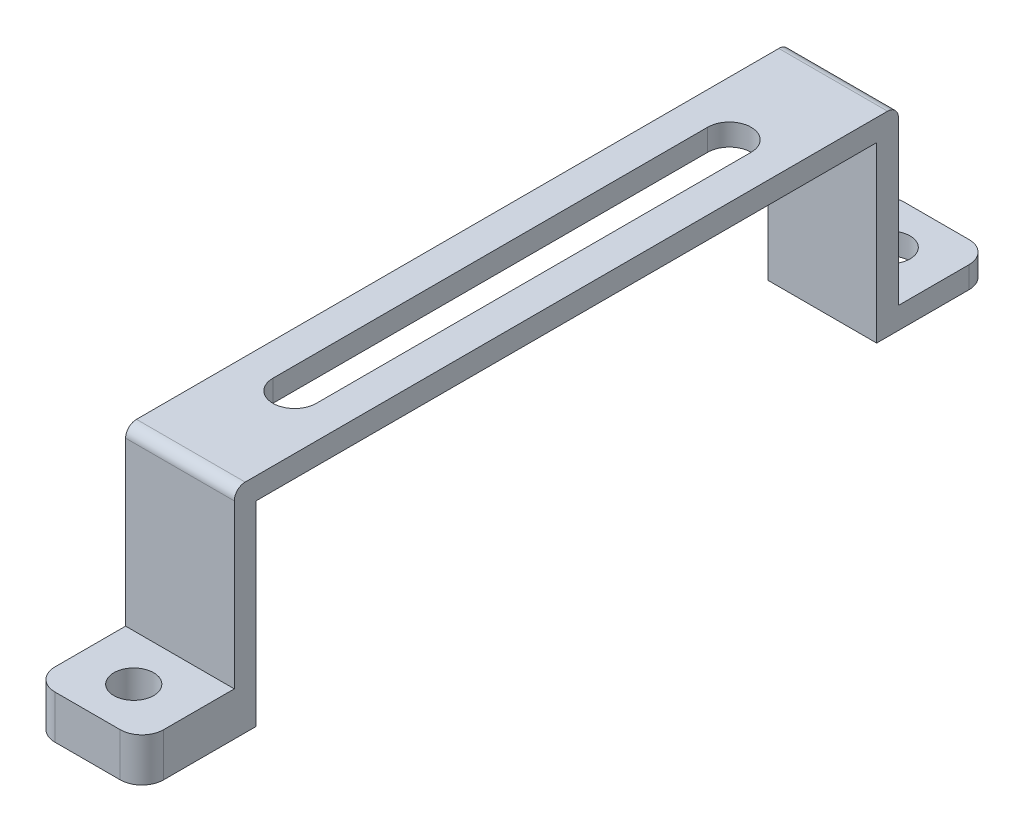
ISO-10303-21;
HEADER;
FILE_DESCRIPTION(('STEP AP214'),'2;1');
FILE_NAME('part.step','',(''),(''),'','','');
FILE_SCHEMA(('AUTOMOTIVE_DESIGN { 1 0 10303 214 1 1 1 1 }'));
ENDSEC;
DATA;
#1=APPLICATION_CONTEXT('core data for automotive mechanical design processes');
#2=APPLICATION_PROTOCOL_DEFINITION('international standard','automotive_design',2000,#1);
#3=PRODUCT_CONTEXT('',#1,'mechanical');
#4=PRODUCT('Part','Part','',(#3));
#5=PRODUCT_RELATED_PRODUCT_CATEGORY('part','',(#4));
#6=PRODUCT_DEFINITION_FORMATION('','',#4);
#7=PRODUCT_DEFINITION_CONTEXT('part definition',#1,'design');
#8=PRODUCT_DEFINITION('design','',#6,#7);
#9=PRODUCT_DEFINITION_SHAPE('','',#8);
#10=(LENGTH_UNIT() NAMED_UNIT(*) SI_UNIT(.MILLI.,.METRE.));
#11=(NAMED_UNIT(*) PLANE_ANGLE_UNIT() SI_UNIT($,.RADIAN.));
#12=(NAMED_UNIT(*) SI_UNIT($,.STERADIAN.) SOLID_ANGLE_UNIT());
#13=UNCERTAINTY_MEASURE_WITH_UNIT(LENGTH_MEASURE(1.E-05),#10,'distance_accuracy_value','');
#14=(GEOMETRIC_REPRESENTATION_CONTEXT(3) GLOBAL_UNCERTAINTY_ASSIGNED_CONTEXT((#13)) GLOBAL_UNIT_ASSIGNED_CONTEXT((#10,
#11,#12)) REPRESENTATION_CONTEXT('',''));
#15=CARTESIAN_POINT('',(0.,0.,0.));
#16=DIRECTION('',(0.,0.,1.));
#17=DIRECTION('',(1.,0.,0.));
#18=AXIS2_PLACEMENT_3D('',#15,#16,#17);
#19=CARTESIAN_POINT('',(0.,0.,0.));
#20=DIRECTION('',(0.,1.,0.));
#21=DIRECTION('',(0.,0.,1.));
#22=AXIS2_PLACEMENT_3D('',#19,#20,#21);
#23=PLANE('',#22);
#24=CARTESIAN_POINT('',(11.7063002694729,0.,8.49782961465778));
#25=DIRECTION('',(0.,1.,0.));
#26=DIRECTION('',(0.,0.,1.));
#27=AXIS2_PLACEMENT_3D('',#24,#25,#26);
#28=CIRCLE('',#27,1.99999999999999);
#29=CARTESIAN_POINT('',(13.7063002694728,0.,8.49782961465778));
#30=VERTEX_POINT('',#29);
#31=CARTESIAN_POINT('',(9.70630026947286,0.,8.49782961465778));
#32=VERTEX_POINT('',#31);
#33=EDGE_CURVE('E313',#30,#32,#28,.T.);
#34=ORIENTED_EDGE('',*,*,#33,.T.);
#35=DIRECTION('',(0.,0.,1.));
#36=VECTOR('',#35,1.);
#37=CARTESIAN_POINT('',(9.70630026947286,0.,8.49782961465778));
#38=LINE('',#37,#36);
#39=CARTESIAN_POINT('',(9.70630026947286,0.,48.4978296146578));
#40=VERTEX_POINT('',#39);
#41=EDGE_CURVE('E332',#32,#40,#38,.T.);
#42=ORIENTED_EDGE('',*,*,#41,.T.);
#43=CARTESIAN_POINT('',(11.7063002694729,0.,48.4978296146578));
#44=DIRECTION('',(0.,1.,0.));
#45=DIRECTION('',(0.,0.,1.));
#46=AXIS2_PLACEMENT_3D('',#43,#44,#45);
#47=CIRCLE('',#46,1.99999999999999);
#48=CARTESIAN_POINT('',(13.7063002694728,0.,48.4978296146578));
#49=VERTEX_POINT('',#48);
#50=EDGE_CURVE('E336',#40,#49,#47,.T.);
#51=ORIENTED_EDGE('',*,*,#50,.T.);
#52=DIRECTION('',(0.,0.,-1.));
#53=VECTOR('',#52,1.);
#54=CARTESIAN_POINT('',(13.7063002694728,0.,8.49782961465778));
#55=LINE('',#54,#53);
#56=EDGE_CURVE('E318',#49,#30,#55,.T.);
#57=ORIENTED_EDGE('',*,*,#56,.T.);
#58=EDGE_LOOP('',(#34,#42,#51,#57));
#59=FACE_BOUND('',#58,.T.);
#60=DIRECTION('',(-1.,0.,0.));
#61=VECTOR('',#60,1.);
#62=CARTESIAN_POINT('',(6.70630026947285,0.,-0.0521703853422189));
#63=LINE('',#62,#61);
#64=CARTESIAN_POINT('',(16.7063002694728,0.,-0.0521703853422206));
#65=VERTEX_POINT('',#64);
#66=CARTESIAN_POINT('',(6.70630026947285,0.,-0.0521703853422189));
#67=VERTEX_POINT('',#66);
#68=EDGE_CURVE('E254',#65,#67,#63,.T.);
#69=ORIENTED_EDGE('',*,*,#68,.F.);
#70=DIRECTION('',(0.,0.,-1.));
#71=VECTOR('',#70,1.);
#72=CARTESIAN_POINT('',(16.7063002694728,0.,-0.00217038534222006));
#73=LINE('',#72,#71);
#74=CARTESIAN_POINT('',(16.7063002694728,0.,57.0478296146578));
#75=VERTEX_POINT('',#74);
#76=EDGE_CURVE('E362',#75,#65,#73,.T.);
#77=ORIENTED_EDGE('',*,*,#76,.F.);
#78=DIRECTION('',(1.,0.,0.));
#79=VECTOR('',#78,1.);
#80=CARTESIAN_POINT('',(6.70630026947285,0.,57.0478296146578));
#81=LINE('',#80,#79);
#82=CARTESIAN_POINT('',(6.70630026947285,0.,57.0478296146578));
#83=VERTEX_POINT('',#82);
#84=EDGE_CURVE('E197',#83,#75,#81,.T.);
#85=ORIENTED_EDGE('',*,*,#84,.F.);
#86=DIRECTION('',(0.,0.,1.));
#87=VECTOR('',#86,1.);
#88=CARTESIAN_POINT('',(6.70630026947285,0.,-0.00217038534221919));
#89=LINE('',#88,#87);
#90=EDGE_CURVE('E356',#67,#83,#89,.T.);
#91=ORIENTED_EDGE('',*,*,#90,.F.);
#92=EDGE_LOOP('',(#69,#77,#85,#91));
#93=FACE_BOUND('',#92,.T.);
#94=ADVANCED_FACE('F39',(#59,#93),#23,.F.);
#95=CARTESIAN_POINT('',(0.,2.,0.));
#96=DIRECTION('',(0.,1.,0.));
#97=DIRECTION('',(0.,0.,1.));
#98=AXIS2_PLACEMENT_3D('',#95,#96,#97);
#99=PLANE('',#98);
#100=DIRECTION('',(0.,0.,1.));
#101=VECTOR('',#100,1.);
#102=CARTESIAN_POINT('',(6.70630026947285,2.,-0.00217038534221919));
#103=LINE('',#102,#101);
#104=CARTESIAN_POINT('',(6.70630026947285,2.,-1.05217038534222));
#105=VERTEX_POINT('',#104);
#106=CARTESIAN_POINT('',(6.70630026947285,2.,58.0478296146578));
#107=VERTEX_POINT('',#106);
#108=EDGE_CURVE('E357',#105,#107,#103,.T.);
#109=ORIENTED_EDGE('',*,*,#108,.T.);
#110=DIRECTION('',(-1.,0.,0.));
#111=VECTOR('',#110,1.);
#112=CARTESIAN_POINT('',(0.,2.,58.0478296146578));
#113=LINE('',#112,#111);
#114=CARTESIAN_POINT('',(16.7063002694728,2.,58.0478296146578));
#115=VERTEX_POINT('',#114);
#116=EDGE_CURVE('E383',#107,#115,#113,.F.);
#117=ORIENTED_EDGE('',*,*,#116,.T.);
#118=DIRECTION('',(0.,0.,-1.));
#119=VECTOR('',#118,1.);
#120=CARTESIAN_POINT('',(16.7063002694728,2.,-0.00217038534222006));
#121=LINE('',#120,#119);
#122=CARTESIAN_POINT('',(16.7063002694728,2.,-1.05217038534222));
#123=VERTEX_POINT('',#122);
#124=EDGE_CURVE('E361',#115,#123,#121,.T.);
#125=ORIENTED_EDGE('',*,*,#124,.T.);
#126=DIRECTION('',(1.,0.,0.));
#127=VECTOR('',#126,1.);
#128=CARTESIAN_POINT('',(0.,2.,-1.05217038534222));
#129=LINE('',#128,#127);
#130=EDGE_CURVE('E380',#123,#105,#129,.F.);
#131=ORIENTED_EDGE('',*,*,#130,.T.);
#132=EDGE_LOOP('',(#109,#117,#125,#131));
#133=FACE_BOUND('',#132,.T.);
#134=DIRECTION('',(0.,0.,1.));
#135=VECTOR('',#134,1.);
#136=CARTESIAN_POINT('',(9.70630026947286,2.,8.49782961465778));
#137=LINE('',#136,#135);
#138=CARTESIAN_POINT('',(9.70630026947286,2.,8.49782961465778));
#139=VERTEX_POINT('',#138);
#140=CARTESIAN_POINT('',(9.70630026947286,2.,48.4978296146578));
#141=VERTEX_POINT('',#140);
#142=EDGE_CURVE('E317',#139,#141,#137,.T.);
#143=ORIENTED_EDGE('',*,*,#142,.F.);
#144=CARTESIAN_POINT('',(11.7063002694729,2.,8.49782961465778));
#145=DIRECTION('',(0.,1.,0.));
#146=DIRECTION('',(0.,0.,1.));
#147=AXIS2_PLACEMENT_3D('',#144,#145,#146);
#148=CIRCLE('',#147,1.99999999999999);
#149=CARTESIAN_POINT('',(13.7063002694728,2.,8.49782961465778));
#150=VERTEX_POINT('',#149);
#151=EDGE_CURVE('E314',#150,#139,#148,.T.);
#152=ORIENTED_EDGE('',*,*,#151,.F.);
#153=DIRECTION('',(0.,0.,-1.));
#154=VECTOR('',#153,1.);
#155=CARTESIAN_POINT('',(13.7063002694728,2.,8.49782961465778));
#156=LINE('',#155,#154);
#157=CARTESIAN_POINT('',(13.7063002694728,2.,48.4978296146578));
#158=VERTEX_POINT('',#157);
#159=EDGE_CURVE('E325',#158,#150,#156,.T.);
#160=ORIENTED_EDGE('',*,*,#159,.F.);
#161=CARTESIAN_POINT('',(11.7063002694729,2.,48.4978296146578));
#162=DIRECTION('',(0.,1.,0.));
#163=DIRECTION('',(0.,0.,1.));
#164=AXIS2_PLACEMENT_3D('',#161,#162,#163);
#165=CIRCLE('',#164,1.99999999999999);
#166=EDGE_CURVE('E321',#141,#158,#165,.T.);
#167=ORIENTED_EDGE('',*,*,#166,.F.);
#168=EDGE_LOOP('',(#143,#152,#160,#167));
#169=FACE_BOUND('',#168,.T.);
#170=ADVANCED_FACE('F495',(#133,#169),#99,.T.);
#171=CARTESIAN_POINT('',(6.70630026947285,2.,-0.00217038534221919));
#172=DIRECTION('',(1.,0.,0.));
#173=DIRECTION('',(0.,0.,-1.));
#174=AXIS2_PLACEMENT_3D('',#171,#172,#173);
#175=PLANE('',#174);
#176=DIRECTION('',(0.,1.,0.));
#177=VECTOR('',#176,1.);
#178=CARTESIAN_POINT('',(6.70630026947285,-15.9766,57.0478296146578));
#179=LINE('',#178,#177);
#180=CARTESIAN_POINT('',(6.70630026947285,-17.9766,57.0478296146578));
#181=VERTEX_POINT('',#180);
#182=EDGE_CURVE('E201',#181,#83,#179,.T.);
#183=ORIENTED_EDGE('',*,*,#182,.F.);
#184=DIRECTION('',(0.,0.,-1.));
#185=VECTOR('',#184,1.);
#186=CARTESIAN_POINT('',(6.70630026947285,-17.9766,67.5478296146578));
#187=LINE('',#186,#185);
#188=CARTESIAN_POINT('',(6.70630026947285,-17.9766,65.5478296146578));
#189=VERTEX_POINT('',#188);
#190=EDGE_CURVE('E212',#189,#181,#187,.T.);
#191=ORIENTED_EDGE('',*,*,#190,.F.);
#192=DIRECTION('',(0.,-1.,0.));
#193=VECTOR('',#192,1.);
#194=CARTESIAN_POINT('',(6.70630026947285,-13.9766,65.5478296146578));
#195=LINE('',#194,#193);
#196=CARTESIAN_POINT('',(6.70630026947285,-13.9766,65.5478296146578));
#197=VERTEX_POINT('',#196);
#198=EDGE_CURVE('E424',#189,#197,#195,.F.);
#199=ORIENTED_EDGE('',*,*,#198,.T.);
#200=DIRECTION('',(0.,0.,-1.));
#201=VECTOR('',#200,1.);
#202=CARTESIAN_POINT('',(6.70630026947285,-13.9766,67.5478296146578));
#203=LINE('',#202,#201);
#204=CARTESIAN_POINT('',(6.70630026947285,-13.9766,59.0478296146578));
#205=VERTEX_POINT('',#204);
#206=EDGE_CURVE('E295',#197,#205,#203,.T.);
#207=ORIENTED_EDGE('',*,*,#206,.T.);
#208=DIRECTION('',(0.,-1.,0.));
#209=VECTOR('',#208,1.);
#210=CARTESIAN_POINT('',(6.70630026947285,2.,59.0478296146578));
#211=LINE('',#210,#209);
#212=CARTESIAN_POINT('',(6.70630026947285,1.,59.0478296146578));
#213=VERTEX_POINT('',#212);
#214=EDGE_CURVE('E305',#213,#205,#211,.T.);
#215=ORIENTED_EDGE('',*,*,#214,.F.);
#216=CARTESIAN_POINT('',(6.70630026947285,1.,58.0478296146578));
#217=DIRECTION('',(1.,0.,0.));
#218=DIRECTION('',(0.,0.,-1.));
#219=AXIS2_PLACEMENT_3D('',#216,#217,#218);
#220=CIRCLE('',#219,1.);
#221=EDGE_CURVE('E377',#213,#107,#220,.F.);
#222=ORIENTED_EDGE('',*,*,#221,.T.);
#223=ORIENTED_EDGE('',*,*,#108,.F.);
#224=CARTESIAN_POINT('',(6.70630026947285,1.,-1.05217038534222));
#225=DIRECTION('',(1.,0.,0.));
#226=DIRECTION('',(0.,0.,-1.));
#227=AXIS2_PLACEMENT_3D('',#224,#225,#226);
#228=CIRCLE('',#227,1.);
#229=CARTESIAN_POINT('',(6.70630026947285,1.,-2.05217038534222));
#230=VERTEX_POINT('',#229);
#231=EDGE_CURVE('E374',#105,#230,#228,.F.);
#232=ORIENTED_EDGE('',*,*,#231,.T.);
#233=DIRECTION('',(0.,1.,0.));
#234=VECTOR('',#233,1.);
#235=CARTESIAN_POINT('',(6.70630026947285,2.,-2.05217038534222));
#236=LINE('',#235,#234);
#237=CARTESIAN_POINT('',(6.70630026947285,-13.9766,-2.05217038534222));
#238=VERTEX_POINT('',#237);
#239=EDGE_CURVE('E278',#238,#230,#236,.T.);
#240=ORIENTED_EDGE('',*,*,#239,.F.);
#241=DIRECTION('',(0.,0.,1.));
#242=VECTOR('',#241,1.);
#243=CARTESIAN_POINT('',(6.70630026947285,-13.9766,-10.5521703853422));
#244=LINE('',#243,#242);
#245=CARTESIAN_POINT('',(6.70630026947285,-13.9766,-8.55217038534222));
#246=VERTEX_POINT('',#245);
#247=EDGE_CURVE('E251',#246,#238,#244,.T.);
#248=ORIENTED_EDGE('',*,*,#247,.F.);
#249=DIRECTION('',(0.,1.,0.));
#250=VECTOR('',#249,1.);
#251=CARTESIAN_POINT('',(6.70630026947285,2.,-8.55217038534222));
#252=LINE('',#251,#250);
#253=CARTESIAN_POINT('',(6.70630026947285,-15.9766,-8.55217038534222));
#254=VERTEX_POINT('',#253);
#255=EDGE_CURVE('E421',#246,#254,#252,.F.);
#256=ORIENTED_EDGE('',*,*,#255,.T.);
#257=DIRECTION('',(0.,0.,-1.));
#258=VECTOR('',#257,1.);
#259=CARTESIAN_POINT('',(6.70630026947285,-15.9766,-2.05217038534222));
#260=LINE('',#259,#258);
#261=CARTESIAN_POINT('',(6.70630026947285,-15.9766,-0.0521703853422189));
#262=VERTEX_POINT('',#261);
#263=EDGE_CURVE('E255',#262,#254,#260,.T.);
#264=ORIENTED_EDGE('',*,*,#263,.F.);
#265=DIRECTION('',(0.,1.,0.));
#266=VECTOR('',#265,1.);
#267=CARTESIAN_POINT('',(6.70630026947285,-15.9766,-0.0521703853422189));
#268=LINE('',#267,#266);
#269=EDGE_CURVE('E265',#262,#67,#268,.T.);
#270=ORIENTED_EDGE('',*,*,#269,.T.);
#271=ORIENTED_EDGE('',*,*,#90,.T.);
#272=EDGE_LOOP('',(#183,#191,#199,#207,#215,#222,#223,#232,#240,#248,#256,#264,#270,#271));
#273=FACE_BOUND('',#272,.T.);
#274=ADVANCED_FACE('F445',(#273),#175,.F.);
#275=CARTESIAN_POINT('',(16.7063002694728,2.,-0.00217038534222006));
#276=DIRECTION('',(-1.,0.,0.));
#277=DIRECTION('',(0.,0.,1.));
#278=AXIS2_PLACEMENT_3D('',#275,#276,#277);
#279=PLANE('',#278);
#280=DIRECTION('',(0.,0.,-1.));
#281=VECTOR('',#280,1.);
#282=CARTESIAN_POINT('',(16.7063002694728,-13.9766,67.5478296146578));
#283=LINE('',#282,#281);
#284=CARTESIAN_POINT('',(16.7063002694728,-13.9766,65.5478296146578));
#285=VERTEX_POINT('',#284);
#286=CARTESIAN_POINT('',(16.7063002694728,-13.9766,59.0478296146578));
#287=VERTEX_POINT('',#286);
#288=EDGE_CURVE('E298',#285,#287,#283,.T.);
#289=ORIENTED_EDGE('',*,*,#288,.F.);
#290=DIRECTION('',(0.,1.,0.));
#291=VECTOR('',#290,1.);
#292=CARTESIAN_POINT('',(16.7063002694728,-17.9766,65.5478296146578));
#293=LINE('',#292,#291);
#294=CARTESIAN_POINT('',(16.7063002694728,-17.9766,65.5478296146578));
#295=VERTEX_POINT('',#294);
#296=EDGE_CURVE('E208',#285,#295,#293,.F.);
#297=ORIENTED_EDGE('',*,*,#296,.T.);
#298=DIRECTION('',(0.,0.,-1.));
#299=VECTOR('',#298,1.);
#300=CARTESIAN_POINT('',(16.7063002694728,-17.9766,67.5478296146578));
#301=LINE('',#300,#299);
#302=CARTESIAN_POINT('',(16.7063002694728,-17.9766,57.0478296146578));
#303=VERTEX_POINT('',#302);
#304=EDGE_CURVE('E204',#295,#303,#301,.T.);
#305=ORIENTED_EDGE('',*,*,#304,.T.);
#306=DIRECTION('',(0.,1.,0.));
#307=VECTOR('',#306,1.);
#308=CARTESIAN_POINT('',(16.7063002694728,-15.9766,57.0478296146578));
#309=LINE('',#308,#307);
#310=EDGE_CURVE('E190',#303,#75,#309,.T.);
#311=ORIENTED_EDGE('',*,*,#310,.T.);
#312=ORIENTED_EDGE('',*,*,#76,.T.);
#313=DIRECTION('',(0.,1.,0.));
#314=VECTOR('',#313,1.);
#315=CARTESIAN_POINT('',(16.7063002694728,-15.9766,-0.0521703853422206));
#316=LINE('',#315,#314);
#317=CARTESIAN_POINT('',(16.7063002694728,-15.9766,-0.0521703853422206));
#318=VERTEX_POINT('',#317);
#319=EDGE_CURVE('E271',#318,#65,#316,.T.);
#320=ORIENTED_EDGE('',*,*,#319,.F.);
#321=DIRECTION('',(0.,0.,1.));
#322=VECTOR('',#321,1.);
#323=CARTESIAN_POINT('',(16.7063002694728,-15.9766,-2.05217038534222));
#324=LINE('',#323,#322);
#325=CARTESIAN_POINT('',(16.7063002694728,-15.9766,-8.55217038534222));
#326=VERTEX_POINT('',#325);
#327=EDGE_CURVE('E259',#326,#318,#324,.T.);
#328=ORIENTED_EDGE('',*,*,#327,.F.);
#329=DIRECTION('',(0.,-1.,0.));
#330=VECTOR('',#329,1.);
#331=CARTESIAN_POINT('',(16.7063002694728,2.,-8.55217038534222));
#332=LINE('',#331,#330);
#333=CARTESIAN_POINT('',(16.7063002694728,-13.9766,-8.55217038534222));
#334=VERTEX_POINT('',#333);
#335=EDGE_CURVE('E410',#326,#334,#332,.F.);
#336=ORIENTED_EDGE('',*,*,#335,.T.);
#337=DIRECTION('',(0.,0.,1.));
#338=VECTOR('',#337,1.);
#339=CARTESIAN_POINT('',(16.7063002694728,-13.9766,-10.5521703853422));
#340=LINE('',#339,#338);
#341=CARTESIAN_POINT('',(16.7063002694728,-13.9766,-2.05217038534222));
#342=VERTEX_POINT('',#341);
#343=EDGE_CURVE('E245',#334,#342,#340,.T.);
#344=ORIENTED_EDGE('',*,*,#343,.T.);
#345=DIRECTION('',(0.,-1.,0.));
#346=VECTOR('',#345,1.);
#347=CARTESIAN_POINT('',(16.7063002694728,2.,-2.05217038534222));
#348=LINE('',#347,#346);
#349=CARTESIAN_POINT('',(16.7063002694728,1.,-2.05217038534222));
#350=VERTEX_POINT('',#349);
#351=EDGE_CURVE('E274',#350,#342,#348,.T.);
#352=ORIENTED_EDGE('',*,*,#351,.F.);
#353=CARTESIAN_POINT('',(16.7063002694728,1.,-1.05217038534222));
#354=DIRECTION('',(-1.,0.,0.));
#355=DIRECTION('',(0.,0.,1.));
#356=AXIS2_PLACEMENT_3D('',#353,#354,#355);
#357=CIRCLE('',#356,1.);
#358=EDGE_CURVE('E386',#350,#123,#357,.F.);
#359=ORIENTED_EDGE('',*,*,#358,.T.);
#360=ORIENTED_EDGE('',*,*,#124,.F.);
#361=CARTESIAN_POINT('',(16.7063002694728,1.,58.0478296146578));
#362=DIRECTION('',(-1.,0.,0.));
#363=DIRECTION('',(0.,0.,1.));
#364=AXIS2_PLACEMENT_3D('',#361,#362,#363);
#365=CIRCLE('',#364,1.);
#366=CARTESIAN_POINT('',(16.7063002694728,1.,59.0478296146578));
#367=VERTEX_POINT('',#366);
#368=EDGE_CURVE('E389',#115,#367,#365,.F.);
#369=ORIENTED_EDGE('',*,*,#368,.T.);
#370=DIRECTION('',(0.,1.,0.));
#371=VECTOR('',#370,1.);
#372=CARTESIAN_POINT('',(16.7063002694728,2.,59.0478296146578));
#373=LINE('',#372,#371);
#374=EDGE_CURVE('E309',#287,#367,#373,.T.);
#375=ORIENTED_EDGE('',*,*,#374,.F.);
#376=EDGE_LOOP('',(#289,#297,#305,#311,#312,#320,#328,#336,#344,#352,#359,#360,#369,#375));
#377=FACE_BOUND('',#376,.T.);
#378=ADVANCED_FACE('F206',(#377),#279,.F.);
#379=CARTESIAN_POINT('',(11.7063002694729,2.,8.49782961465778));
#380=DIRECTION('',(0.,-1.,0.));
#381=DIRECTION('',(0.,0.,-1.));
#382=AXIS2_PLACEMENT_3D('',#379,#380,#381);
#383=CYLINDRICAL_SURFACE('',#382,1.99999999999999);
#384=ORIENTED_EDGE('',*,*,#33,.F.);
#385=DIRECTION('',(0.,-1.,0.));
#386=VECTOR('',#385,1.);
#387=CARTESIAN_POINT('',(13.7063002694728,2.,8.49782961465778));
#388=LINE('',#387,#386);
#389=EDGE_CURVE('E328',#150,#30,#388,.T.);
#390=ORIENTED_EDGE('',*,*,#389,.F.);
#391=ORIENTED_EDGE('',*,*,#151,.T.);
#392=DIRECTION('',(0.,-1.,0.));
#393=VECTOR('',#392,1.);
#394=CARTESIAN_POINT('',(9.70630026947286,2.,8.49782961465778));
#395=LINE('',#394,#393);
#396=EDGE_CURVE('E352',#139,#32,#395,.T.);
#397=ORIENTED_EDGE('',*,*,#396,.T.);
#398=EDGE_LOOP('',(#384,#390,#391,#397));
#399=FACE_BOUND('',#398,.T.);
#400=ADVANCED_FACE('F523',(#399),#383,.F.);
#401=CARTESIAN_POINT('',(9.70630026947286,2.,8.49782961465778));
#402=DIRECTION('',(1.,0.,0.));
#403=DIRECTION('',(0.,0.,-1.));
#404=AXIS2_PLACEMENT_3D('',#401,#402,#403);
#405=PLANE('',#404);
#406=ORIENTED_EDGE('',*,*,#41,.F.);
#407=ORIENTED_EDGE('',*,*,#396,.F.);
#408=ORIENTED_EDGE('',*,*,#142,.T.);
#409=DIRECTION('',(0.,-1.,0.));
#410=VECTOR('',#409,1.);
#411=CARTESIAN_POINT('',(9.70630026947286,2.,48.4978296146578));
#412=LINE('',#411,#410);
#413=EDGE_CURVE('E349',#141,#40,#412,.T.);
#414=ORIENTED_EDGE('',*,*,#413,.T.);
#415=EDGE_LOOP('',(#406,#407,#408,#414));
#416=FACE_BOUND('',#415,.T.);
#417=ADVANCED_FACE('F690',(#416),#405,.T.);
#418=CARTESIAN_POINT('',(11.7063002694729,2.,48.4978296146578));
#419=DIRECTION('',(0.,-1.,0.));
#420=DIRECTION('',(0.,0.,-1.));
#421=AXIS2_PLACEMENT_3D('',#418,#419,#420);
#422=CYLINDRICAL_SURFACE('',#421,1.99999999999999);
#423=ORIENTED_EDGE('',*,*,#50,.F.);
#424=ORIENTED_EDGE('',*,*,#413,.F.);
#425=ORIENTED_EDGE('',*,*,#166,.T.);
#426=DIRECTION('',(0.,-1.,0.));
#427=VECTOR('',#426,1.);
#428=CARTESIAN_POINT('',(13.7063002694728,2.,48.4978296146578));
#429=LINE('',#428,#427);
#430=EDGE_CURVE('E346',#158,#49,#429,.T.);
#431=ORIENTED_EDGE('',*,*,#430,.T.);
#432=EDGE_LOOP('',(#423,#424,#425,#431));
#433=FACE_BOUND('',#432,.T.);
#434=ADVANCED_FACE('F679',(#433),#422,.F.);
#435=CARTESIAN_POINT('',(13.7063002694728,2.,8.49782961465778));
#436=DIRECTION('',(-1.,0.,0.));
#437=DIRECTION('',(0.,0.,1.));
#438=AXIS2_PLACEMENT_3D('',#435,#436,#437);
#439=PLANE('',#438);
#440=ORIENTED_EDGE('',*,*,#56,.F.);
#441=ORIENTED_EDGE('',*,*,#430,.F.);
#442=ORIENTED_EDGE('',*,*,#159,.T.);
#443=ORIENTED_EDGE('',*,*,#389,.T.);
#444=EDGE_LOOP('',(#440,#441,#442,#443));
#445=FACE_BOUND('',#444,.T.);
#446=ADVANCED_FACE('F674',(#445),#439,.T.);
#447=CARTESIAN_POINT('',(0.,0.,59.0478296146578));
#448=DIRECTION('',(0.,0.,1.));
#449=DIRECTION('',(1.,0.,0.));
#450=AXIS2_PLACEMENT_3D('',#447,#448,#449);
#451=PLANE('',#450);
#452=ORIENTED_EDGE('',*,*,#374,.T.);
#453=DIRECTION('',(-1.,0.,0.));
#454=VECTOR('',#453,1.);
#455=CARTESIAN_POINT('',(0.,1.,59.0478296146578));
#456=LINE('',#455,#454);
#457=EDGE_CURVE('E366',#367,#213,#456,.T.);
#458=ORIENTED_EDGE('',*,*,#457,.T.);
#459=ORIENTED_EDGE('',*,*,#214,.T.);
#460=DIRECTION('',(-1.,0.,0.));
#461=VECTOR('',#460,1.);
#462=CARTESIAN_POINT('',(16.7063002694728,-13.9766,59.0478296146578));
#463=LINE('',#462,#461);
#464=EDGE_CURVE('E282',#287,#205,#463,.T.);
#465=ORIENTED_EDGE('',*,*,#464,.F.);
#466=EDGE_LOOP('',(#452,#458,#459,#465));
#467=FACE_BOUND('',#466,.T.);
#468=ADVANCED_FACE('F487',(#467),#451,.T.);
#469=CARTESIAN_POINT('',(6.70630026947285,-15.9766,57.0478296146578));
#470=DIRECTION('',(0.,0.,1.));
#471=DIRECTION('',(1.,0.,0.));
#472=AXIS2_PLACEMENT_3D('',#469,#470,#471);
#473=PLANE('',#472);
#474=ORIENTED_EDGE('',*,*,#84,.T.);
#475=ORIENTED_EDGE('',*,*,#310,.F.);
#476=DIRECTION('',(1.,0.,0.));
#477=VECTOR('',#476,1.);
#478=CARTESIAN_POINT('',(6.70630026947285,-17.9766,57.0478296146578));
#479=LINE('',#478,#477);
#480=EDGE_CURVE('E195',#181,#303,#479,.T.);
#481=ORIENTED_EDGE('',*,*,#480,.F.);
#482=ORIENTED_EDGE('',*,*,#182,.T.);
#483=EDGE_LOOP('',(#474,#475,#481,#482));
#484=FACE_BOUND('',#483,.T.);
#485=ADVANCED_FACE('F192',(#484),#473,.F.);
#486=CARTESIAN_POINT('',(16.7063002694728,-13.9766,67.5478296146578));
#487=DIRECTION('',(0.,-1.,0.));
#488=DIRECTION('',(0.,0.,-1.));
#489=AXIS2_PLACEMENT_3D('',#486,#487,#488);
#490=PLANE('',#489);
#491=CARTESIAN_POINT('',(11.7063002694728,-13.9766,63.2978296146578));
#492=DIRECTION('',(0.,1.,0.));
#493=DIRECTION('',(0.,0.,1.));
#494=AXIS2_PLACEMENT_3D('',#491,#492,#493);
#495=CIRCLE('',#494,1.82879999999999);
#496=CARTESIAN_POINT('',(11.7063002694728,-13.9766,65.1266296146578));
#497=VERTEX_POINT('',#496);
#498=EDGE_CURVE('E219',#497,#497,#495,.T.);
#499=ORIENTED_EDGE('',*,*,#498,.F.);
#500=EDGE_LOOP('',(#499));
#501=FACE_BOUND('',#500,.T.);
#502=DIRECTION('',(-1.,0.,0.));
#503=VECTOR('',#502,1.);
#504=CARTESIAN_POINT('',(16.7063002694728,-13.9766,67.5478296146578));
#505=LINE('',#504,#503);
#506=CARTESIAN_POINT('',(14.7063002694728,-13.9766,67.5478296146578));
#507=VERTEX_POINT('',#506);
#508=CARTESIAN_POINT('',(8.70630026947285,-13.9766,67.5478296146578));
#509=VERTEX_POINT('',#508);
#510=EDGE_CURVE('E283',#507,#509,#505,.T.);
#511=ORIENTED_EDGE('',*,*,#510,.F.);
#512=CARTESIAN_POINT('',(14.7063002694728,-13.9766,65.5478296146578));
#513=DIRECTION('',(0.,-1.,0.));
#514=DIRECTION('',(0.,0.,-1.));
#515=AXIS2_PLACEMENT_3D('',#512,#513,#514);
#516=CIRCLE('',#515,2.);
#517=EDGE_CURVE('E407',#507,#285,#516,.F.);
#518=ORIENTED_EDGE('',*,*,#517,.T.);
#519=ORIENTED_EDGE('',*,*,#288,.T.);
#520=ORIENTED_EDGE('',*,*,#464,.T.);
#521=ORIENTED_EDGE('',*,*,#206,.F.);
#522=CARTESIAN_POINT('',(8.70630026947285,-13.9766,65.5478296146578));
#523=DIRECTION('',(0.,-1.,0.));
#524=DIRECTION('',(0.,0.,-1.));
#525=AXIS2_PLACEMENT_3D('',#522,#523,#524);
#526=CIRCLE('',#525,2.);
#527=EDGE_CURVE('E404',#197,#509,#526,.F.);
#528=ORIENTED_EDGE('',*,*,#527,.T.);
#529=EDGE_LOOP('',(#511,#518,#519,#520,#521,#528));
#530=FACE_BOUND('',#529,.T.);
#531=ADVANCED_FACE('F474',(#501,#530),#490,.F.);
#532=CARTESIAN_POINT('',(16.7063002694728,-17.9766,67.5478296146578));
#533=DIRECTION('',(0.,1.,0.));
#534=DIRECTION('',(0.,0.,1.));
#535=AXIS2_PLACEMENT_3D('',#532,#533,#534);
#536=PLANE('',#535);
#537=CARTESIAN_POINT('',(11.7063002694728,-17.9766,63.2978296146578));
#538=DIRECTION('',(0.,1.,0.));
#539=DIRECTION('',(0.,0.,1.));
#540=AXIS2_PLACEMENT_3D('',#537,#538,#539);
#541=CIRCLE('',#540,1.82879999999999);
#542=CARTESIAN_POINT('',(11.7063002694728,-17.9766,65.1266296146578));
#543=VERTEX_POINT('',#542);
#544=EDGE_CURVE('E223',#543,#543,#541,.T.);
#545=ORIENTED_EDGE('',*,*,#544,.T.);
#546=EDGE_LOOP('',(#545));
#547=FACE_BOUND('',#546,.T.);
#548=ORIENTED_EDGE('',*,*,#304,.F.);
#549=CARTESIAN_POINT('',(14.7063002694728,-17.9766,65.5478296146578));
#550=DIRECTION('',(0.,1.,0.));
#551=DIRECTION('',(0.,0.,1.));
#552=AXIS2_PLACEMENT_3D('',#549,#550,#551);
#553=CIRCLE('',#552,2.);
#554=CARTESIAN_POINT('',(14.7063002694728,-17.9766,67.5478296146578));
#555=VERTEX_POINT('',#554);
#556=EDGE_CURVE('E418',#295,#555,#553,.F.);
#557=ORIENTED_EDGE('',*,*,#556,.T.);
#558=DIRECTION('',(1.,0.,0.));
#559=VECTOR('',#558,1.);
#560=CARTESIAN_POINT('',(16.7063002694728,-17.9766,67.5478296146578));
#561=LINE('',#560,#559);
#562=CARTESIAN_POINT('',(8.70630026947285,-17.9766,67.5478296146578));
#563=VERTEX_POINT('',#562);
#564=EDGE_CURVE('E213',#563,#555,#561,.T.);
#565=ORIENTED_EDGE('',*,*,#564,.F.);
#566=CARTESIAN_POINT('',(8.70630026947285,-17.9766,65.5478296146578));
#567=DIRECTION('',(0.,1.,0.));
#568=DIRECTION('',(0.,0.,1.));
#569=AXIS2_PLACEMENT_3D('',#566,#567,#568);
#570=CIRCLE('',#569,2.);
#571=EDGE_CURVE('E415',#563,#189,#570,.F.);
#572=ORIENTED_EDGE('',*,*,#571,.T.);
#573=ORIENTED_EDGE('',*,*,#190,.T.);
#574=ORIENTED_EDGE('',*,*,#480,.T.);
#575=EDGE_LOOP('',(#548,#557,#565,#572,#573,#574));
#576=FACE_BOUND('',#575,.T.);
#577=ADVANCED_FACE('F216',(#547,#576),#536,.F.);
#578=CARTESIAN_POINT('',(0.,0.,67.5478296146578));
#579=DIRECTION('',(0.,0.,1.));
#580=DIRECTION('',(1.,0.,0.));
#581=AXIS2_PLACEMENT_3D('',#578,#579,#580);
#582=PLANE('',#581);
#583=ORIENTED_EDGE('',*,*,#564,.T.);
#584=DIRECTION('',(0.,1.,0.));
#585=VECTOR('',#584,1.);
#586=CARTESIAN_POINT('',(14.7063002694728,-13.9766,67.5478296146578));
#587=LINE('',#586,#585);
#588=EDGE_CURVE('E400',#555,#507,#587,.T.);
#589=ORIENTED_EDGE('',*,*,#588,.T.);
#590=ORIENTED_EDGE('',*,*,#510,.T.);
#591=DIRECTION('',(0.,-1.,0.));
#592=VECTOR('',#591,1.);
#593=CARTESIAN_POINT('',(8.70630026947285,-17.9766,67.5478296146578));
#594=LINE('',#593,#592);
#595=EDGE_CURVE('E396',#509,#563,#594,.T.);
#596=ORIENTED_EDGE('',*,*,#595,.T.);
#597=EDGE_LOOP('',(#583,#589,#590,#596));
#598=FACE_BOUND('',#597,.T.);
#599=ADVANCED_FACE('F476',(#598),#582,.T.);
#600=CARTESIAN_POINT('',(0.,0.,-2.05217038534222));
#601=DIRECTION('',(0.,0.,-1.));
#602=DIRECTION('',(-1.,0.,0.));
#603=AXIS2_PLACEMENT_3D('',#600,#601,#602);
#604=PLANE('',#603);
#605=ORIENTED_EDGE('',*,*,#239,.T.);
#606=DIRECTION('',(1.,0.,0.));
#607=VECTOR('',#606,1.);
#608=CARTESIAN_POINT('',(0.,1.,-2.05217038534222));
#609=LINE('',#608,#607);
#610=EDGE_CURVE('E392',#230,#350,#609,.T.);
#611=ORIENTED_EDGE('',*,*,#610,.T.);
#612=ORIENTED_EDGE('',*,*,#351,.T.);
#613=DIRECTION('',(1.,0.,0.));
#614=VECTOR('',#613,1.);
#615=CARTESIAN_POINT('',(16.7063002694728,-13.9766,-2.05217038534222));
#616=LINE('',#615,#614);
#617=EDGE_CURVE('E237',#238,#342,#616,.T.);
#618=ORIENTED_EDGE('',*,*,#617,.F.);
#619=EDGE_LOOP('',(#605,#611,#612,#618));
#620=FACE_BOUND('',#619,.T.);
#621=ADVANCED_FACE('F502',(#620),#604,.T.);
#622=CARTESIAN_POINT('',(6.70630026947285,-15.9766,-0.0521703853422189));
#623=DIRECTION('',(0.,0.,-1.));
#624=DIRECTION('',(-1.,0.,0.));
#625=AXIS2_PLACEMENT_3D('',#622,#623,#624);
#626=PLANE('',#625);
#627=ORIENTED_EDGE('',*,*,#68,.T.);
#628=ORIENTED_EDGE('',*,*,#269,.F.);
#629=DIRECTION('',(-1.,0.,0.));
#630=VECTOR('',#629,1.);
#631=CARTESIAN_POINT('',(6.70630026947285,-15.9766,-0.0521703853422189));
#632=LINE('',#631,#630);
#633=EDGE_CURVE('E262',#318,#262,#632,.T.);
#634=ORIENTED_EDGE('',*,*,#633,.F.);
#635=ORIENTED_EDGE('',*,*,#319,.T.);
#636=EDGE_LOOP('',(#627,#628,#634,#635));
#637=FACE_BOUND('',#636,.T.);
#638=ADVANCED_FACE('F463',(#637),#626,.F.);
#639=CARTESIAN_POINT('',(0.,-15.9766,0.));
#640=DIRECTION('',(0.,1.,0.));
#641=DIRECTION('',(0.,0.,1.));
#642=AXIS2_PLACEMENT_3D('',#639,#640,#641);
#643=PLANE('',#642);
#644=CARTESIAN_POINT('',(11.7063002694728,-15.9766,-6.30217038534222));
#645=DIRECTION('',(0.,1.,0.));
#646=DIRECTION('',(0.,0.,1.));
#647=AXIS2_PLACEMENT_3D('',#644,#645,#646);
#648=CIRCLE('',#647,1.82879999999999);
#649=CARTESIAN_POINT('',(11.7063002694728,-15.9766,-4.47337038534223));
#650=VERTEX_POINT('',#649);
#651=EDGE_CURVE('E233',#650,#650,#648,.T.);
#652=ORIENTED_EDGE('',*,*,#651,.T.);
#653=EDGE_LOOP('',(#652));
#654=FACE_BOUND('',#653,.T.);
#655=DIRECTION('',(-1.,0.,0.));
#656=VECTOR('',#655,1.);
#657=CARTESIAN_POINT('',(16.7063002694728,-15.9766,-10.5521703853422));
#658=LINE('',#657,#656);
#659=CARTESIAN_POINT('',(14.7063002694728,-15.9766,-10.5521703853422));
#660=VERTEX_POINT('',#659);
#661=CARTESIAN_POINT('',(8.70630026947285,-15.9766,-10.5521703853422));
#662=VERTEX_POINT('',#661);
#663=EDGE_CURVE('E238',#660,#662,#658,.T.);
#664=ORIENTED_EDGE('',*,*,#663,.F.);
#665=CARTESIAN_POINT('',(14.7063002694728,-15.9766,-8.55217038534222));
#666=DIRECTION('',(0.,1.,0.));
#667=DIRECTION('',(0.,0.,1.));
#668=AXIS2_PLACEMENT_3D('',#665,#666,#667);
#669=CIRCLE('',#668,2.);
#670=EDGE_CURVE('E437',#660,#326,#669,.F.);
#671=ORIENTED_EDGE('',*,*,#670,.T.);
#672=ORIENTED_EDGE('',*,*,#327,.T.);
#673=ORIENTED_EDGE('',*,*,#633,.T.);
#674=ORIENTED_EDGE('',*,*,#263,.T.);
#675=CARTESIAN_POINT('',(8.70630026947285,-15.9766,-8.55217038534222));
#676=DIRECTION('',(0.,1.,0.));
#677=DIRECTION('',(0.,0.,1.));
#678=AXIS2_PLACEMENT_3D('',#675,#676,#677);
#679=CIRCLE('',#678,2.);
#680=EDGE_CURVE('E434',#254,#662,#679,.F.);
#681=ORIENTED_EDGE('',*,*,#680,.T.);
#682=EDGE_LOOP('',(#664,#671,#672,#673,#674,#681));
#683=FACE_BOUND('',#682,.T.);
#684=ADVANCED_FACE('F450',(#654,#683),#643,.F.);
#685=CARTESIAN_POINT('',(16.7063002694728,-13.9766,-10.5521703853422));
#686=DIRECTION('',(0.,-1.,0.));
#687=DIRECTION('',(0.,0.,-1.));
#688=AXIS2_PLACEMENT_3D('',#685,#686,#687);
#689=PLANE('',#688);
#690=CARTESIAN_POINT('',(11.7063002694728,-13.9766,-6.30217038534222));
#691=DIRECTION('',(0.,1.,0.));
#692=DIRECTION('',(0.,0.,1.));
#693=AXIS2_PLACEMENT_3D('',#690,#691,#692);
#694=CIRCLE('',#693,1.82879999999999);
#695=CARTESIAN_POINT('',(11.7063002694728,-13.9766,-4.47337038534223));
#696=VERTEX_POINT('',#695);
#697=EDGE_CURVE('E229',#696,#696,#694,.T.);
#698=ORIENTED_EDGE('',*,*,#697,.F.);
#699=EDGE_LOOP('',(#698));
#700=FACE_BOUND('',#699,.T.);
#701=ORIENTED_EDGE('',*,*,#343,.F.);
#702=CARTESIAN_POINT('',(14.7063002694728,-13.9766,-8.55217038534222));
#703=DIRECTION('',(0.,-1.,0.));
#704=DIRECTION('',(0.,0.,-1.));
#705=AXIS2_PLACEMENT_3D('',#702,#703,#704);
#706=CIRCLE('',#705,2.);
#707=CARTESIAN_POINT('',(14.7063002694728,-13.9766,-10.5521703853422));
#708=VERTEX_POINT('',#707);
#709=EDGE_CURVE('E11',#334,#708,#706,.F.);
#710=ORIENTED_EDGE('',*,*,#709,.T.);
#711=DIRECTION('',(1.,0.,0.));
#712=VECTOR('',#711,1.);
#713=CARTESIAN_POINT('',(16.7063002694728,-13.9766,-10.5521703853422));
#714=LINE('',#713,#712);
#715=CARTESIAN_POINT('',(8.70630026947285,-13.9766,-10.5521703853422));
#716=VERTEX_POINT('',#715);
#717=EDGE_CURVE('E242',#716,#708,#714,.T.);
#718=ORIENTED_EDGE('',*,*,#717,.F.);
#719=CARTESIAN_POINT('',(8.70630026947285,-13.9766,-8.55217038534222));
#720=DIRECTION('',(0.,-1.,0.));
#721=DIRECTION('',(0.,0.,-1.));
#722=AXIS2_PLACEMENT_3D('',#719,#720,#721);
#723=CIRCLE('',#722,2.);
#724=EDGE_CURVE('E48',#716,#246,#723,.F.);
#725=ORIENTED_EDGE('',*,*,#724,.T.);
#726=ORIENTED_EDGE('',*,*,#247,.T.);
#727=ORIENTED_EDGE('',*,*,#617,.T.);
#728=EDGE_LOOP('',(#701,#710,#718,#725,#726,#727));
#729=FACE_BOUND('',#728,.T.);
#730=ADVANCED_FACE('F441',(#700,#729),#689,.F.);
#731=CARTESIAN_POINT('',(0.,0.,-10.5521703853422));
#732=DIRECTION('',(0.,0.,1.));
#733=DIRECTION('',(1.,0.,0.));
#734=AXIS2_PLACEMENT_3D('',#731,#732,#733);
#735=PLANE('',#734);
#736=ORIENTED_EDGE('',*,*,#717,.T.);
#737=DIRECTION('',(0.,-1.,0.));
#738=VECTOR('',#737,1.);
#739=CARTESIAN_POINT('',(14.7063002694728,0.,-10.5521703853422));
#740=LINE('',#739,#738);
#741=EDGE_CURVE('E430',#708,#660,#740,.T.);
#742=ORIENTED_EDGE('',*,*,#741,.T.);
#743=ORIENTED_EDGE('',*,*,#663,.T.);
#744=DIRECTION('',(0.,1.,0.));
#745=VECTOR('',#744,1.);
#746=CARTESIAN_POINT('',(8.70630026947285,0.,-10.5521703853422));
#747=LINE('',#746,#745);
#748=EDGE_CURVE('E427',#662,#716,#747,.T.);
#749=ORIENTED_EDGE('',*,*,#748,.T.);
#750=EDGE_LOOP('',(#736,#742,#743,#749));
#751=FACE_BOUND('',#750,.T.);
#752=ADVANCED_FACE('F452',(#751),#735,.F.);
#753=CARTESIAN_POINT('',(11.7063002694728,-13.9766,-6.30217038534222));
#754=DIRECTION('',(0.,1.,0.));
#755=DIRECTION('',(0.,0.,1.));
#756=AXIS2_PLACEMENT_3D('',#753,#754,#755);
#757=CYLINDRICAL_SURFACE('',#756,1.82879999999999);
#758=ORIENTED_EDGE('',*,*,#697,.T.);
#759=EDGE_LOOP('',(#758));
#760=FACE_BOUND('',#759,.T.);
#761=ORIENTED_EDGE('',*,*,#651,.F.);
#762=EDGE_LOOP('',(#761));
#763=FACE_BOUND('',#762,.T.);
#764=ADVANCED_FACE('F619',(#760,#763),#757,.F.);
#765=CARTESIAN_POINT('',(11.7063002694728,-13.9766,63.2978296146578));
#766=DIRECTION('',(0.,1.,0.));
#767=DIRECTION('',(0.,0.,1.));
#768=AXIS2_PLACEMENT_3D('',#765,#766,#767);
#769=CYLINDRICAL_SURFACE('',#768,1.82879999999999);
#770=ORIENTED_EDGE('',*,*,#498,.T.);
#771=EDGE_LOOP('',(#770));
#772=FACE_BOUND('',#771,.T.);
#773=ORIENTED_EDGE('',*,*,#544,.F.);
#774=EDGE_LOOP('',(#773));
#775=FACE_BOUND('',#774,.T.);
#776=ADVANCED_FACE('F528',(#772,#775),#769,.F.);
#777=CARTESIAN_POINT('',(0.,1.,58.0478296146578));
#778=DIRECTION('',(-1.,0.,0.));
#779=DIRECTION('',(0.,0.,1.));
#780=AXIS2_PLACEMENT_3D('',#777,#778,#779);
#781=CYLINDRICAL_SURFACE('',#780,1.);
#782=ORIENTED_EDGE('',*,*,#368,.F.);
#783=ORIENTED_EDGE('',*,*,#116,.F.);
#784=ORIENTED_EDGE('',*,*,#221,.F.);
#785=ORIENTED_EDGE('',*,*,#457,.F.);
#786=EDGE_LOOP('',(#782,#783,#784,#785));
#787=FACE_BOUND('',#786,.T.);
#788=ADVANCED_FACE('F490',(#787),#781,.T.);
#789=CARTESIAN_POINT('',(0.,1.,-1.05217038534222));
#790=DIRECTION('',(1.,0.,0.));
#791=DIRECTION('',(0.,0.,-1.));
#792=AXIS2_PLACEMENT_3D('',#789,#790,#791);
#793=CYLINDRICAL_SURFACE('',#792,1.);
#794=ORIENTED_EDGE('',*,*,#231,.F.);
#795=ORIENTED_EDGE('',*,*,#130,.F.);
#796=ORIENTED_EDGE('',*,*,#358,.F.);
#797=ORIENTED_EDGE('',*,*,#610,.F.);
#798=EDGE_LOOP('',(#794,#795,#796,#797));
#799=FACE_BOUND('',#798,.T.);
#800=ADVANCED_FACE('F499',(#799),#793,.T.);
#801=CARTESIAN_POINT('',(14.7063002694728,0.,65.5478296146578));
#802=DIRECTION('',(0.,-1.,0.));
#803=DIRECTION('',(0.,0.,-1.));
#804=AXIS2_PLACEMENT_3D('',#801,#802,#803);
#805=CYLINDRICAL_SURFACE('',#804,2.);
#806=ORIENTED_EDGE('',*,*,#556,.F.);
#807=ORIENTED_EDGE('',*,*,#296,.F.);
#808=ORIENTED_EDGE('',*,*,#517,.F.);
#809=ORIENTED_EDGE('',*,*,#588,.F.);
#810=EDGE_LOOP('',(#806,#807,#808,#809));
#811=FACE_BOUND('',#810,.T.);
#812=ADVANCED_FACE('F480',(#811),#805,.T.);
#813=CARTESIAN_POINT('',(8.70630026947285,0.,65.5478296146578));
#814=DIRECTION('',(0.,1.,0.));
#815=DIRECTION('',(0.,0.,1.));
#816=AXIS2_PLACEMENT_3D('',#813,#814,#815);
#817=CYLINDRICAL_SURFACE('',#816,2.);
#818=ORIENTED_EDGE('',*,*,#527,.F.);
#819=ORIENTED_EDGE('',*,*,#198,.F.);
#820=ORIENTED_EDGE('',*,*,#571,.F.);
#821=ORIENTED_EDGE('',*,*,#595,.F.);
#822=EDGE_LOOP('',(#818,#819,#820,#821));
#823=FACE_BOUND('',#822,.T.);
#824=ADVANCED_FACE('F470',(#823),#817,.T.);
#825=CARTESIAN_POINT('',(14.7063002694728,0.,-8.55217038534222));
#826=DIRECTION('',(0.,-1.,0.));
#827=DIRECTION('',(0.,0.,-1.));
#828=AXIS2_PLACEMENT_3D('',#825,#826,#827);
#829=CYLINDRICAL_SURFACE('',#828,2.);
#830=ORIENTED_EDGE('',*,*,#709,.F.);
#831=ORIENTED_EDGE('',*,*,#335,.F.);
#832=ORIENTED_EDGE('',*,*,#670,.F.);
#833=ORIENTED_EDGE('',*,*,#741,.F.);
#834=EDGE_LOOP('',(#830,#831,#832,#833));
#835=FACE_BOUND('',#834,.T.);
#836=ADVANCED_FACE('F455',(#835),#829,.T.);
#837=CARTESIAN_POINT('',(8.70630026947285,0.,-8.55217038534222));
#838=DIRECTION('',(0.,1.,0.));
#839=DIRECTION('',(0.,0.,1.));
#840=AXIS2_PLACEMENT_3D('',#837,#838,#839);
#841=CYLINDRICAL_SURFACE('',#840,2.);
#842=ORIENTED_EDGE('',*,*,#680,.F.);
#843=ORIENTED_EDGE('',*,*,#255,.F.);
#844=ORIENTED_EDGE('',*,*,#724,.F.);
#845=ORIENTED_EDGE('',*,*,#748,.F.);
#846=EDGE_LOOP('',(#842,#843,#844,#845));
#847=FACE_BOUND('',#846,.T.);
#848=ADVANCED_FACE('F41',(#847),#841,.T.);
#849=CLOSED_SHELL('',(#94,#170,#274,#378,#400,#417,#434,#446,#468,#485,#531,#577,#599,#621,#638,
#684,#730,#752,#764,#776,#788,#800,#812,#824,#836,#848));
#850=MANIFOLD_SOLID_BREP('B2',#849);
#851=ADVANCED_BREP_SHAPE_REPRESENTATION('',(#18,#850),#14);
#852=SHAPE_DEFINITION_REPRESENTATION(#9,#851);
ENDSEC;
END-ISO-10303-21;
